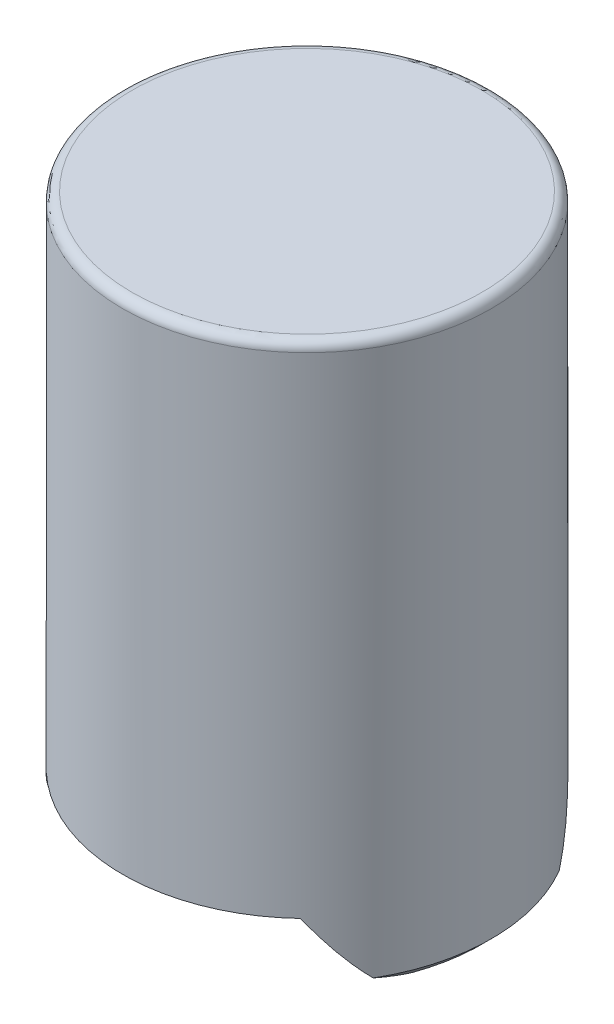
ISO-10303-21;
HEADER;
FILE_DESCRIPTION(('STEP AP214'),'2;1');
FILE_NAME('part.step','',(''),(''),'','','');
FILE_SCHEMA(('AUTOMOTIVE_DESIGN { 1 0 10303 214 1 1 1 1 }'));
ENDSEC;
DATA;
#1=APPLICATION_CONTEXT('core data for automotive mechanical design processes');
#2=APPLICATION_PROTOCOL_DEFINITION('international standard','automotive_design',2000,#1);
#3=PRODUCT_CONTEXT('',#1,'mechanical');
#4=PRODUCT('Part','Part','',(#3));
#5=PRODUCT_RELATED_PRODUCT_CATEGORY('part','',(#4));
#6=PRODUCT_DEFINITION_FORMATION('','',#4);
#7=PRODUCT_DEFINITION_CONTEXT('part definition',#1,'design');
#8=PRODUCT_DEFINITION('design','',#6,#7);
#9=PRODUCT_DEFINITION_SHAPE('','',#8);
#10=(LENGTH_UNIT() NAMED_UNIT(*) SI_UNIT(.MILLI.,.METRE.));
#11=(NAMED_UNIT(*) PLANE_ANGLE_UNIT() SI_UNIT($,.RADIAN.));
#12=(NAMED_UNIT(*) SI_UNIT($,.STERADIAN.) SOLID_ANGLE_UNIT());
#13=UNCERTAINTY_MEASURE_WITH_UNIT(LENGTH_MEASURE(1.E-05),#10,'distance_accuracy_value','');
#14=(GEOMETRIC_REPRESENTATION_CONTEXT(3) GLOBAL_UNCERTAINTY_ASSIGNED_CONTEXT((#13)) GLOBAL_UNIT_ASSIGNED_CONTEXT((#10,
#11,#12)) REPRESENTATION_CONTEXT('',''));
#15=CARTESIAN_POINT('',(0.,0.,0.));
#16=DIRECTION('',(0.,0.,1.));
#17=DIRECTION('',(1.,0.,0.));
#18=AXIS2_PLACEMENT_3D('',#15,#16,#17);
#19=CARTESIAN_POINT('',(0.,0.,0.));
#20=DIRECTION('',(0.,1.,0.));
#21=DIRECTION('',(0.,0.,1.));
#22=AXIS2_PLACEMENT_3D('',#19,#20,#21);
#23=PLANE('',#22);
#24=DIRECTION('',(0.,0.,1.));
#25=VECTOR('',#24,1.);
#26=CARTESIAN_POINT('',(-8.74999999999999,0.,0.));
#27=LINE('',#26,#25);
#28=CARTESIAN_POINT('',(-8.74999999999999,0.,-3.15079355083765));
#29=VERTEX_POINT('',#28);
#30=CARTESIAN_POINT('',(-8.74999999999999,0.,3.15079355083765));
#31=VERTEX_POINT('',#30);
#32=EDGE_CURVE('E191',#29,#31,#27,.T.);
#33=ORIENTED_EDGE('',*,*,#32,.T.);
#34=CARTESIAN_POINT('',(0.,0.,0.));
#35=DIRECTION('',(0.,1.,0.));
#36=DIRECTION('',(0.,0.,1.));
#37=AXIS2_PLACEMENT_3D('',#34,#35,#36);
#38=CIRCLE('',#37,9.3);
#39=EDGE_CURVE('E254',#31,#29,#38,.F.);
#40=ORIENTED_EDGE('',*,*,#39,.T.);
#41=EDGE_LOOP('',(#33,#40));
#42=FACE_BOUND('',#41,.T.);
#43=ADVANCED_FACE('F82',(#42),#23,.F.);
#44=CARTESIAN_POINT('',(0.,30.,0.));
#45=DIRECTION('',(0.,-1.,0.));
#46=DIRECTION('',(0.,0.,-1.));
#47=AXIS2_PLACEMENT_3D('',#44,#45,#46);
#48=CYLINDRICAL_SURFACE('',#47,9.8);
#49=CARTESIAN_POINT('',(0.,29.5,0.));
#50=DIRECTION('',(0.,1.,0.));
#51=DIRECTION('',(0.,0.,1.));
#52=AXIS2_PLACEMENT_3D('',#49,#50,#51);
#53=CIRCLE('',#52,9.8);
#54=CARTESIAN_POINT('',(0.,29.5,9.8));
#55=VERTEX_POINT('',#54);
#56=EDGE_CURVE('E184',#55,#55,#53,.F.);
#57=ORIENTED_EDGE('',*,*,#56,.T.);
#58=EDGE_LOOP('',(#57));
#59=FACE_BOUND('',#58,.T.);
#60=CARTESIAN_POINT('',(0.,15.1554445662277,0.));
#61=DIRECTION('',(-0.86602540378444,0.499999999999998,0.));
#62=DIRECTION('',(-0.499999999999998,-0.86602540378444,0.));
#63=AXIS2_PLACEMENT_3D('',#60,#61,#62);
#64=ELLIPSE('',#63,19.6000000000001,9.8);
#65=CARTESIAN_POINT('',(-6.75,3.46410161513776,-7.10475193092624));
#66=VERTEX_POINT('',#65);
#67=CARTESIAN_POINT('',(-8.46132486540519,0.499999999999999,-4.94428776691608));
#68=VERTEX_POINT('',#67);
#69=EDGE_CURVE('E147',#66,#68,#64,.T.);
#70=ORIENTED_EDGE('',*,*,#69,.T.);
#71=CARTESIAN_POINT('',(0.,0.499999999999997,0.));
#72=DIRECTION('',(0.,1.,0.));
#73=DIRECTION('',(0.,0.,1.));
#74=AXIS2_PLACEMENT_3D('',#71,#72,#73);
#75=CIRCLE('',#74,9.8);
#76=CARTESIAN_POINT('',(-8.46132486540519,0.499999999999994,4.94428776691608));
#77=VERTEX_POINT('',#76);
#78=EDGE_CURVE('E198',#68,#77,#75,.T.);
#79=ORIENTED_EDGE('',*,*,#78,.T.);
#80=CARTESIAN_POINT('',(-6.75,3.46410161513776,7.10475193092624));
#81=VERTEX_POINT('',#80);
#82=EDGE_CURVE('E179',#77,#81,#64,.T.);
#83=ORIENTED_EDGE('',*,*,#82,.T.);
#84=CARTESIAN_POINT('',(0.,3.46410161513776,0.));
#85=DIRECTION('',(0.,1.,0.));
#86=DIRECTION('',(0.,0.,1.));
#87=AXIS2_PLACEMENT_3D('',#84,#85,#86);
#88=CIRCLE('',#87,9.8);
#89=CARTESIAN_POINT('',(6.75,3.46410161513776,7.10475193092623));
#90=VERTEX_POINT('',#89);
#91=EDGE_CURVE('E159',#81,#90,#88,.T.);
#92=ORIENTED_EDGE('',*,*,#91,.T.);
#93=CARTESIAN_POINT('',(0.,15.1554445662277,0.));
#94=DIRECTION('',(0.86602540378444,0.499999999999998,0.));
#95=DIRECTION('',(0.499999999999998,-0.86602540378444,0.));
#96=AXIS2_PLACEMENT_3D('',#93,#94,#95);
#97=ELLIPSE('',#96,19.6000000000001,9.8);
#98=CARTESIAN_POINT('',(8.46132486540519,0.499999999999999,4.94428776691608));
#99=VERTEX_POINT('',#98);
#100=EDGE_CURVE('E148',#90,#99,#97,.T.);
#101=ORIENTED_EDGE('',*,*,#100,.T.);
#102=CARTESIAN_POINT('',(0.,0.499999999999997,0.));
#103=DIRECTION('',(0.,1.,0.));
#104=DIRECTION('',(0.,0.,1.));
#105=AXIS2_PLACEMENT_3D('',#102,#103,#104);
#106=CIRCLE('',#105,9.8);
#107=CARTESIAN_POINT('',(8.46132486540519,0.499999999999994,-4.94428776691608));
#108=VERTEX_POINT('',#107);
#109=EDGE_CURVE('E144',#99,#108,#106,.T.);
#110=ORIENTED_EDGE('',*,*,#109,.T.);
#111=CARTESIAN_POINT('',(6.75,3.46410161513776,-7.10475193092624));
#112=VERTEX_POINT('',#111);
#113=EDGE_CURVE('E137',#108,#112,#97,.T.);
#114=ORIENTED_EDGE('',*,*,#113,.T.);
#115=EDGE_CURVE('E141',#112,#66,#88,.T.);
#116=ORIENTED_EDGE('',*,*,#115,.T.);
#117=EDGE_LOOP('',(#70,#79,#83,#92,#101,#110,#114,#116));
#118=FACE_BOUND('',#117,.T.);
#119=ADVANCED_FACE('F140',(#59,#118),#48,.T.);
#120=CARTESIAN_POINT('',(0.,30.,0.));
#121=DIRECTION('',(0.,1.,0.));
#122=DIRECTION('',(0.,0.,1.));
#123=AXIS2_PLACEMENT_3D('',#120,#121,#122);
#124=PLANE('',#123);
#125=CARTESIAN_POINT('',(0.,30.,0.));
#126=DIRECTION('',(0.,1.,0.));
#127=DIRECTION('',(0.,0.,1.));
#128=AXIS2_PLACEMENT_3D('',#125,#126,#127);
#129=CIRCLE('',#128,9.3);
#130=CARTESIAN_POINT('',(0.,30.,9.3));
#131=VERTEX_POINT('',#130);
#132=EDGE_CURVE('E180',#131,#131,#129,.T.);
#133=ORIENTED_EDGE('',*,*,#132,.T.);
#134=EDGE_LOOP('',(#133));
#135=FACE_BOUND('',#134,.T.);
#136=ADVANCED_FACE('F229',(#135),#124,.T.);
#137=DIRECTION('',(0.,0.,-1.));
#138=VECTOR('',#137,1.);
#139=CARTESIAN_POINT('',(8.74999999999999,0.,0.));
#140=LINE('',#139,#138);
#141=CARTESIAN_POINT('',(8.74999999999999,0.,3.15079355083765));
#142=VERTEX_POINT('',#141);
#143=CARTESIAN_POINT('',(8.74999999999999,0.,-3.15079355083765));
#144=VERTEX_POINT('',#143);
#145=EDGE_CURVE('E188',#142,#144,#140,.T.);
#146=ORIENTED_EDGE('',*,*,#145,.T.);
#147=CARTESIAN_POINT('',(0.,0.,0.));
#148=DIRECTION('',(0.,1.,0.));
#149=DIRECTION('',(0.,0.,1.));
#150=AXIS2_PLACEMENT_3D('',#147,#148,#149);
#151=CIRCLE('',#150,9.3);
#152=EDGE_CURVE('E105',#144,#142,#151,.F.);
#153=ORIENTED_EDGE('',*,*,#152,.T.);
#154=EDGE_LOOP('',(#146,#153));
#155=FACE_BOUND('',#154,.T.);
#156=ADVANCED_FACE('F233',(#155),#23,.F.);
#157=CARTESIAN_POINT('',(0.,29.5,0.));
#158=DIRECTION('',(0.,1.,0.));
#159=DIRECTION('',(0.,0.,1.));
#160=AXIS2_PLACEMENT_3D('',#157,#158,#159);
#161=TOROIDAL_SURFACE('',#160,9.3,0.5);
#162=ORIENTED_EDGE('',*,*,#56,.F.);
#163=EDGE_LOOP('',(#162));
#164=FACE_BOUND('',#163,.T.);
#165=ORIENTED_EDGE('',*,*,#132,.F.);
#166=EDGE_LOOP('',(#165));
#167=FACE_BOUND('',#166,.T.);
#168=ADVANCED_FACE('F237',(#164,#167),#161,.T.);
#169=CARTESIAN_POINT('',(6.75,3.46410161513776,-9.8));
#170=DIRECTION('',(0.,1.,0.));
#171=DIRECTION('',(0.,0.,1.));
#172=AXIS2_PLACEMENT_3D('',#169,#170,#171);
#173=PLANE('',#172);
#174=CARTESIAN_POINT('',(0.,3.46410161513776,0.));
#175=DIRECTION('',(0.,1.,0.));
#176=DIRECTION('',(0.,0.,1.));
#177=AXIS2_PLACEMENT_3D('',#174,#175,#176);
#178=CIRCLE('',#177,2.);
#179=CARTESIAN_POINT('',(0.,3.46410161513776,2.));
#180=VERTEX_POINT('',#179);
#181=EDGE_CURVE('E12',#180,#180,#178,.T.);
#182=ORIENTED_EDGE('',*,*,#181,.T.);
#183=EDGE_LOOP('',(#182));
#184=FACE_BOUND('',#183,.T.);
#185=DIRECTION('',(0.,0.,1.));
#186=VECTOR('',#185,1.);
#187=CARTESIAN_POINT('',(6.75,3.46410161513776,-9.8));
#188=LINE('',#187,#186);
#189=EDGE_CURVE('E155',#112,#90,#188,.T.);
#190=ORIENTED_EDGE('',*,*,#189,.T.);
#191=ORIENTED_EDGE('',*,*,#91,.F.);
#192=DIRECTION('',(0.,0.,1.));
#193=VECTOR('',#192,1.);
#194=CARTESIAN_POINT('',(-6.75,3.46410161513776,-9.8));
#195=LINE('',#194,#193);
#196=EDGE_CURVE('E157',#66,#81,#195,.T.);
#197=ORIENTED_EDGE('',*,*,#196,.F.);
#198=ORIENTED_EDGE('',*,*,#115,.F.);
#199=EDGE_LOOP('',(#190,#191,#197,#198));
#200=FACE_BOUND('',#199,.T.);
#201=ADVANCED_FACE('F153',(#184,#200),#173,.F.);
#202=CARTESIAN_POINT('',(-6.75,3.46410161513776,-9.8));
#203=DIRECTION('',(-0.86602540378444,0.499999999999998,0.));
#204=DIRECTION('',(-0.499999999999998,-0.86602540378444,0.));
#205=AXIS2_PLACEMENT_3D('',#202,#203,#204);
#206=PLANE('',#205);
#207=ORIENTED_EDGE('',*,*,#82,.F.);
#208=CARTESIAN_POINT('',(-8.46132486540518,0.499999999999997,4.94428776691608));
#209=CARTESIAN_POINT('',(-8.48980116773283,0.450677597556814,4.79779620030347));
#210=CARTESIAN_POINT('',(-8.51726169529923,0.403114568609172,4.65050744291059));
#211=CARTESIAN_POINT('',(-8.5699954682095,0.311776994653787,4.35452885671036));
#212=CARTESIAN_POINT('',(-8.59527074148824,0.267998937159824,4.20584047203301));
#213=CARTESIAN_POINT('',(-8.64353391603179,0.18440466671582,3.90697020394455));
#214=CARTESIAN_POINT('',(-8.66652165405928,0.144588736501133,3.75678821479052));
#215=CARTESIAN_POINT('',(-8.71009966346694,0.0691094101143474,3.45488770645157));
#216=CARTESIAN_POINT('',(-8.73068766308383,0.0334499487516866,3.30316787674308));
#217=CARTESIAN_POINT('',(-8.74999999999999,0.,3.15079355083765));
#218=B_SPLINE_CURVE_WITH_KNOTS('',3,(#208,#209,#210,#211,#212,#213,#214,#215,#216,#217),
.UNSPECIFIED.,.F.,.F.,(4,2,2,2,4),(0.,0.471514072175905,0.942585770297785,1.41369105978291,
1.88523876989546),.UNSPECIFIED.);
#219=EDGE_CURVE('E211',#77,#31,#218,.T.);
#220=ORIENTED_EDGE('',*,*,#219,.T.);
#221=ORIENTED_EDGE('',*,*,#32,.F.);
#222=CARTESIAN_POINT('',(-8.74999999999999,0.,-3.15079355083765));
#223=CARTESIAN_POINT('',(-8.73068766308383,0.0334499487516869,-3.30316787674308));
#224=CARTESIAN_POINT('',(-8.71009966346694,0.0691094101143476,-3.45488770645157));
#225=CARTESIAN_POINT('',(-8.66652165405928,0.144588736501133,-3.75678821479052));
#226=CARTESIAN_POINT('',(-8.64353391603179,0.18440466671582,-3.90697020394455));
#227=CARTESIAN_POINT('',(-8.59527074148824,0.267998937159824,-4.20584047203301));
#228=CARTESIAN_POINT('',(-8.5699954682095,0.311776994653787,-4.35452885671036));
#229=CARTESIAN_POINT('',(-8.51726169529923,0.403114568609172,-4.65050744291059));
#230=CARTESIAN_POINT('',(-8.48980116773283,0.450677597556815,-4.79779620030348));
#231=CARTESIAN_POINT('',(-8.46132486540518,0.499999999999997,-4.94428776691608));
#232=B_SPLINE_CURVE_WITH_KNOTS('',3,(#222,#223,#224,#225,#226,#227,#228,#229,#230,#231),
.UNSPECIFIED.,.F.,.F.,(4,2,2,2,4),(0.,0.471547710112556,0.942652999597677,1.41372469771956,
1.88523876989546),.UNSPECIFIED.);
#233=EDGE_CURVE('E202',#29,#68,#232,.T.);
#234=ORIENTED_EDGE('',*,*,#233,.T.);
#235=ORIENTED_EDGE('',*,*,#69,.F.);
#236=ORIENTED_EDGE('',*,*,#196,.T.);
#237=EDGE_LOOP('',(#207,#220,#221,#234,#235,#236));
#238=FACE_BOUND('',#237,.T.);
#239=ADVANCED_FACE('F221',(#238),#206,.F.);
#240=CARTESIAN_POINT('',(6.75,3.46410161513776,-9.8));
#241=DIRECTION('',(0.86602540378444,0.499999999999998,0.));
#242=DIRECTION('',(-0.499999999999998,0.86602540378444,0.));
#243=AXIS2_PLACEMENT_3D('',#240,#241,#242);
#244=PLANE('',#243);
#245=ORIENTED_EDGE('',*,*,#113,.F.);
#246=CARTESIAN_POINT('',(8.46132486540518,0.499999999999997,-4.94428776691608));
#247=CARTESIAN_POINT('',(8.48980116773283,0.450677597556814,-4.79779620030347));
#248=CARTESIAN_POINT('',(8.51726169529923,0.403114568609172,-4.65050744291059));
#249=CARTESIAN_POINT('',(8.5699954682095,0.311776994653787,-4.35452885671036));
#250=CARTESIAN_POINT('',(8.59527074148824,0.267998937159824,-4.20584047203301));
#251=CARTESIAN_POINT('',(8.64353391603179,0.18440466671582,-3.90697020394455));
#252=CARTESIAN_POINT('',(8.66652165405928,0.144588736501133,-3.75678821479052));
#253=CARTESIAN_POINT('',(8.71009966346694,0.0691094101143474,-3.45488770645157));
#254=CARTESIAN_POINT('',(8.73068766308383,0.0334499487516866,-3.30316787674308));
#255=CARTESIAN_POINT('',(8.74999999999999,0.,-3.15079355083765));
#256=B_SPLINE_CURVE_WITH_KNOTS('',3,(#246,#247,#248,#249,#250,#251,#252,#253,#254,#255),
.UNSPECIFIED.,.F.,.F.,(4,2,2,2,4),(0.,0.471514072175905,0.942585770297785,1.41369105978291,
1.88523876989546),.UNSPECIFIED.);
#257=EDGE_CURVE('E99',#108,#144,#256,.T.);
#258=ORIENTED_EDGE('',*,*,#257,.T.);
#259=ORIENTED_EDGE('',*,*,#145,.F.);
#260=CARTESIAN_POINT('',(8.74999999999999,0.,3.15079355083765));
#261=CARTESIAN_POINT('',(8.73068766308383,0.0334499487516869,3.30316787674308));
#262=CARTESIAN_POINT('',(8.71009966346694,0.0691094101143476,3.45488770645157));
#263=CARTESIAN_POINT('',(8.66652165405928,0.144588736501133,3.75678821479052));
#264=CARTESIAN_POINT('',(8.64353391603179,0.18440466671582,3.90697020394455));
#265=CARTESIAN_POINT('',(8.59527074148824,0.267998937159824,4.20584047203301));
#266=CARTESIAN_POINT('',(8.5699954682095,0.311776994653787,4.35452885671036));
#267=CARTESIAN_POINT('',(8.51726169529923,0.403114568609172,4.65050744291059));
#268=CARTESIAN_POINT('',(8.48980116773283,0.450677597556815,4.79779620030348));
#269=CARTESIAN_POINT('',(8.46132486540518,0.499999999999997,4.94428776691608));
#270=B_SPLINE_CURVE_WITH_KNOTS('',3,(#260,#261,#262,#263,#264,#265,#266,#267,#268,#269),
.UNSPECIFIED.,.F.,.F.,(4,2,2,2,4),(0.,0.471547710112556,0.942652999597677,1.41372469771956,
1.88523876989546),.UNSPECIFIED.);
#271=EDGE_CURVE('E259',#142,#99,#270,.T.);
#272=ORIENTED_EDGE('',*,*,#271,.T.);
#273=ORIENTED_EDGE('',*,*,#100,.F.);
#274=ORIENTED_EDGE('',*,*,#189,.F.);
#275=EDGE_LOOP('',(#245,#258,#259,#272,#273,#274));
#276=FACE_BOUND('',#275,.T.);
#277=ADVANCED_FACE('F162',(#276),#244,.F.);
#278=CARTESIAN_POINT('',(0.,0.499999999999997,0.));
#279=DIRECTION('',(0.,1.,0.));
#280=DIRECTION('',(0.,0.,1.));
#281=AXIS2_PLACEMENT_3D('',#278,#279,#280);
#282=CONICAL_SURFACE('',#281,9.8,0.785398163397452);
#283=ORIENTED_EDGE('',*,*,#233,.F.);
#284=ORIENTED_EDGE('',*,*,#39,.F.);
#285=ORIENTED_EDGE('',*,*,#219,.F.);
#286=ORIENTED_EDGE('',*,*,#78,.F.);
#287=EDGE_LOOP('',(#283,#284,#285,#286));
#288=FACE_BOUND('',#287,.T.);
#289=ADVANCED_FACE('F218',(#288),#282,.T.);
#290=CARTESIAN_POINT('',(0.,0.499999999999997,0.));
#291=DIRECTION('',(0.,1.,0.));
#292=DIRECTION('',(0.,0.,1.));
#293=AXIS2_PLACEMENT_3D('',#290,#291,#292);
#294=CONICAL_SURFACE('',#293,9.8,0.785398163397452);
#295=ORIENTED_EDGE('',*,*,#271,.F.);
#296=ORIENTED_EDGE('',*,*,#152,.F.);
#297=ORIENTED_EDGE('',*,*,#257,.F.);
#298=ORIENTED_EDGE('',*,*,#109,.F.);
#299=EDGE_LOOP('',(#295,#296,#297,#298));
#300=FACE_BOUND('',#299,.T.);
#301=ADVANCED_FACE('F276',(#300),#294,.T.);
#302=CARTESIAN_POINT('',(0.,10.4641016151378,0.));
#303=DIRECTION('',(0.,-1.,0.));
#304=DIRECTION('',(0.,0.,-1.));
#305=AXIS2_PLACEMENT_3D('',#302,#303,#304);
#306=CYLINDRICAL_SURFACE('',#305,1.5);
#307=CARTESIAN_POINT('',(0.,3.96410161513776,0.));
#308=DIRECTION('',(0.,1.,0.));
#309=DIRECTION('',(0.,0.,1.));
#310=AXIS2_PLACEMENT_3D('',#307,#308,#309);
#311=CIRCLE('',#310,1.5);
#312=CARTESIAN_POINT('',(0.,3.96410161513776,1.5));
#313=VERTEX_POINT('',#312);
#314=EDGE_CURVE('E92',#313,#313,#311,.F.);
#315=ORIENTED_EDGE('',*,*,#314,.T.);
#316=EDGE_LOOP('',(#315));
#317=FACE_BOUND('',#316,.T.);
#318=CARTESIAN_POINT('',(0.,10.4641016151378,0.));
#319=DIRECTION('',(0.,-1.,0.));
#320=DIRECTION('',(0.,0.,-1.));
#321=AXIS2_PLACEMENT_3D('',#318,#319,#320);
#322=CIRCLE('',#321,1.5);
#323=CARTESIAN_POINT('',(0.,10.4641016151378,-1.5));
#324=VERTEX_POINT('',#323);
#325=EDGE_CURVE('E351',#324,#324,#322,.T.);
#326=ORIENTED_EDGE('',*,*,#325,.F.);
#327=EDGE_LOOP('',(#326));
#328=FACE_BOUND('',#327,.T.);
#329=ADVANCED_FACE('F281',(#317,#328),#306,.F.);
#330=CARTESIAN_POINT('',(0.,10.4641016151378,0.));
#331=DIRECTION('',(0.,-1.,0.));
#332=DIRECTION('',(0.,0.,-1.));
#333=AXIS2_PLACEMENT_3D('',#330,#331,#332);
#334=CYLINDRICAL_SURFACE('',#333,3.);
#335=CARTESIAN_POINT('',(0.,10.4641016151378,0.));
#336=DIRECTION('',(0.,-1.,0.));
#337=DIRECTION('',(0.,0.,-1.));
#338=AXIS2_PLACEMENT_3D('',#335,#336,#337);
#339=CIRCLE('',#338,3.);
#340=CARTESIAN_POINT('',(0.,10.4641016151378,-3.));
#341=VERTEX_POINT('',#340);
#342=EDGE_CURVE('E345',#341,#341,#339,.T.);
#343=ORIENTED_EDGE('',*,*,#342,.T.);
#344=EDGE_LOOP('',(#343));
#345=FACE_BOUND('',#344,.T.);
#346=CARTESIAN_POINT('',(0.,5.46410161513776,0.));
#347=DIRECTION('',(0.,-1.,0.));
#348=DIRECTION('',(1.,0.,0.));
#349=AXIS2_PLACEMENT_3D('',#346,#347,#348);
#350=CIRCLE('',#349,3.);
#351=CARTESIAN_POINT('',(3.,5.46410161513777,0.));
#352=VERTEX_POINT('',#351);
#353=EDGE_CURVE('E340',#352,#352,#350,.T.);
#354=ORIENTED_EDGE('',*,*,#353,.F.);
#355=EDGE_LOOP('',(#354));
#356=FACE_BOUND('',#355,.T.);
#357=ADVANCED_FACE('F288',(#345,#356),#334,.T.);
#358=CARTESIAN_POINT('',(0.,10.4641016151378,0.));
#359=DIRECTION('',(0.,-1.,0.));
#360=DIRECTION('',(0.,0.,-1.));
#361=AXIS2_PLACEMENT_3D('',#358,#359,#360);
#362=PLANE('',#361);
#363=ORIENTED_EDGE('',*,*,#325,.T.);
#364=EDGE_LOOP('',(#363));
#365=FACE_BOUND('',#364,.T.);
#366=ORIENTED_EDGE('',*,*,#342,.F.);
#367=EDGE_LOOP('',(#366));
#368=FACE_BOUND('',#367,.T.);
#369=ADVANCED_FACE('F385',(#365,#368),#362,.F.);
#370=CARTESIAN_POINT('',(0.,28.4641016151378,0.));
#371=DIRECTION('',(0.,-1.,0.));
#372=DIRECTION('',(1.,0.,0.));
#373=AXIS2_PLACEMENT_3D('',#370,#371,#372);
#374=PLANE('',#373);
#375=CARTESIAN_POINT('',(0.,28.4641016151378,0.));
#376=DIRECTION('',(0.,-1.,0.));
#377=DIRECTION('',(1.,0.,0.));
#378=AXIS2_PLACEMENT_3D('',#375,#376,#377);
#379=CIRCLE('',#378,8.);
#380=CARTESIAN_POINT('',(7.99999999999992,28.4641016151378,0.));
#381=VERTEX_POINT('',#380);
#382=EDGE_CURVE('E164',#381,#381,#379,.T.);
#383=ORIENTED_EDGE('',*,*,#382,.T.);
#384=EDGE_LOOP('',(#383));
#385=FACE_BOUND('',#384,.T.);
#386=ADVANCED_FACE('F379',(#385),#374,.T.);
#387=CARTESIAN_POINT('',(0.,28.4641016151378,0.));
#388=DIRECTION('',(0.,-1.,0.));
#389=DIRECTION('',(1.,0.,0.));
#390=AXIS2_PLACEMENT_3D('',#387,#388,#389);
#391=CYLINDRICAL_SURFACE('',#390,8.);
#392=ORIENTED_EDGE('',*,*,#382,.F.);
#393=EDGE_LOOP('',(#392));
#394=FACE_BOUND('',#393,.T.);
#395=CARTESIAN_POINT('',(0.,5.46410161513776,0.));
#396=DIRECTION('',(0.,-1.,0.));
#397=DIRECTION('',(1.,0.,0.));
#398=AXIS2_PLACEMENT_3D('',#395,#396,#397);
#399=CIRCLE('',#398,8.);
#400=CARTESIAN_POINT('',(7.99999999999999,5.46410161513779,0.));
#401=VERTEX_POINT('',#400);
#402=EDGE_CURVE('E172',#401,#401,#399,.T.);
#403=ORIENTED_EDGE('',*,*,#402,.T.);
#404=EDGE_LOOP('',(#403));
#405=FACE_BOUND('',#404,.T.);
#406=ADVANCED_FACE('F372',(#394,#405),#391,.F.);
#407=CARTESIAN_POINT('',(0.,5.46410161513776,0.));
#408=DIRECTION('',(0.,-1.,0.));
#409=DIRECTION('',(1.,0.,0.));
#410=AXIS2_PLACEMENT_3D('',#407,#408,#409);
#411=PLANE('',#410);
#412=ORIENTED_EDGE('',*,*,#353,.T.);
#413=EDGE_LOOP('',(#412));
#414=FACE_BOUND('',#413,.T.);
#415=ORIENTED_EDGE('',*,*,#402,.F.);
#416=EDGE_LOOP('',(#415));
#417=FACE_BOUND('',#416,.T.);
#418=ADVANCED_FACE('F366',(#414,#417),#411,.F.);
#419=CARTESIAN_POINT('',(0.,3.96410161513776,0.));
#420=DIRECTION('',(0.,-1.,0.));
#421=DIRECTION('',(0.,0.,-1.));
#422=AXIS2_PLACEMENT_3D('',#419,#420,#421);
#423=CONICAL_SURFACE('',#422,1.5,0.785398163397449);
#424=ORIENTED_EDGE('',*,*,#181,.F.);
#425=EDGE_LOOP('',(#424));
#426=FACE_BOUND('',#425,.T.);
#427=ORIENTED_EDGE('',*,*,#314,.F.);
#428=EDGE_LOOP('',(#427));
#429=FACE_BOUND('',#428,.T.);
#430=ADVANCED_FACE('F85',(#426,#429),#423,.F.);
#431=CLOSED_SHELL('',(#43,#119,#136,#156,#168,#201,#239,#277,#289,#301,#329,#357,#369,#386,#406,
#418,#430));
#432=MANIFOLD_SOLID_BREP('B2',#431);
#433=ADVANCED_BREP_SHAPE_REPRESENTATION('',(#18,#432),#14);
#434=SHAPE_DEFINITION_REPRESENTATION(#9,#433);
ENDSEC;
END-ISO-10303-21;
